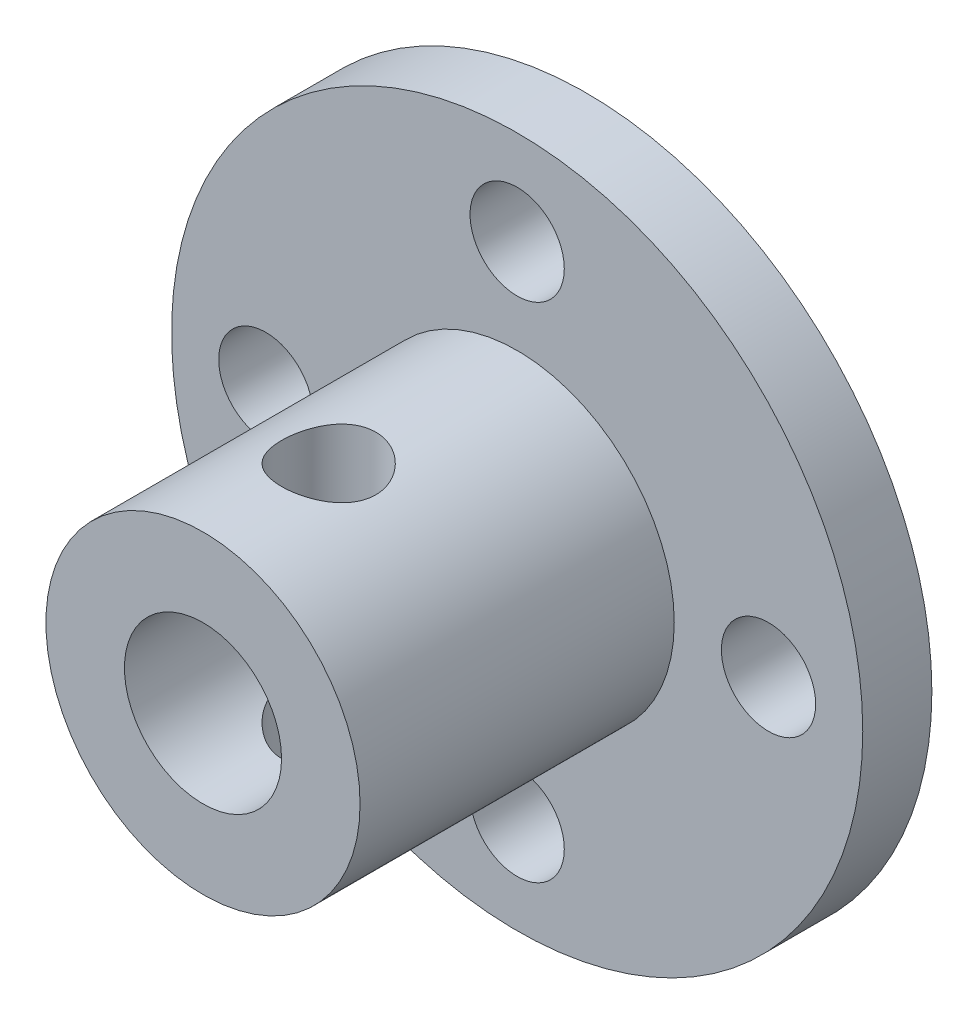
ISO-10303-21;
HEADER;
FILE_DESCRIPTION(('STEP AP214'),'2;1');
FILE_NAME('part.step','',(''),(''),'','','');
FILE_SCHEMA(('AUTOMOTIVE_DESIGN { 1 0 10303 214 1 1 1 1 }'));
ENDSEC;
DATA;
#1=APPLICATION_CONTEXT('core data for automotive mechanical design processes');
#2=APPLICATION_PROTOCOL_DEFINITION('international standard','automotive_design',2000,#1);
#3=PRODUCT_CONTEXT('',#1,'mechanical');
#4=PRODUCT('Part','Part','',(#3));
#5=PRODUCT_RELATED_PRODUCT_CATEGORY('part','',(#4));
#6=PRODUCT_DEFINITION_FORMATION('','',#4);
#7=PRODUCT_DEFINITION_CONTEXT('part definition',#1,'design');
#8=PRODUCT_DEFINITION('design','',#6,#7);
#9=PRODUCT_DEFINITION_SHAPE('','',#8);
#10=(LENGTH_UNIT() NAMED_UNIT(*) SI_UNIT(.MILLI.,.METRE.));
#11=(NAMED_UNIT(*) PLANE_ANGLE_UNIT() SI_UNIT($,.RADIAN.));
#12=(NAMED_UNIT(*) SI_UNIT($,.STERADIAN.) SOLID_ANGLE_UNIT());
#13=UNCERTAINTY_MEASURE_WITH_UNIT(LENGTH_MEASURE(1.E-05),#10,'distance_accuracy_value','');
#14=(GEOMETRIC_REPRESENTATION_CONTEXT(3) GLOBAL_UNCERTAINTY_ASSIGNED_CONTEXT((#13)) GLOBAL_UNIT_ASSIGNED_CONTEXT((#10,
#11,#12)) REPRESENTATION_CONTEXT('',''));
#15=CARTESIAN_POINT('',(0.,0.,0.));
#16=DIRECTION('',(0.,0.,1.));
#17=DIRECTION('',(1.,0.,0.));
#18=AXIS2_PLACEMENT_3D('',#15,#16,#17);
#19=CARTESIAN_POINT('',(0.,0.,2.2));
#20=DIRECTION('',(0.,0.,1.));
#21=DIRECTION('',(1.,0.,0.));
#22=AXIS2_PLACEMENT_3D('',#19,#20,#21);
#23=PLANE('',#22);
#24=CARTESIAN_POINT('',(0.,0.,2.2));
#25=DIRECTION('',(0.,0.,1.));
#26=DIRECTION('',(1.,0.,0.));
#27=AXIS2_PLACEMENT_3D('',#24,#25,#26);
#28=CIRCLE('',#27,5.);
#29=CARTESIAN_POINT('',(5.,0.,2.2));
#30=VERTEX_POINT('',#29);
#31=EDGE_CURVE('E142',#30,#30,#28,.T.);
#32=ORIENTED_EDGE('',*,*,#31,.F.);
#33=EDGE_LOOP('',(#32));
#34=FACE_BOUND('',#33,.T.);
#35=CARTESIAN_POINT('',(4.51808198568511E-13,-8.,2.2));
#36=DIRECTION('',(0.,0.,1.));
#37=DIRECTION('',(1.,0.,0.));
#38=AXIS2_PLACEMENT_3D('',#35,#36,#37);
#39=CIRCLE('',#38,1.50000000000049);
#40=CARTESIAN_POINT('',(1.50000000000094,-8.,2.2));
#41=VERTEX_POINT('',#40);
#42=EDGE_CURVE('E146',#41,#41,#39,.T.);
#43=ORIENTED_EDGE('',*,*,#42,.F.);
#44=EDGE_LOOP('',(#43));
#45=FACE_BOUND('',#44,.T.);
#46=CARTESIAN_POINT('',(0.,8.,2.2));
#47=DIRECTION('',(0.,0.,1.));
#48=DIRECTION('',(1.,0.,0.));
#49=AXIS2_PLACEMENT_3D('',#46,#47,#48);
#50=CIRCLE('',#49,1.5);
#51=CARTESIAN_POINT('',(1.5,8.,2.2));
#52=VERTEX_POINT('',#51);
#53=EDGE_CURVE('E49',#52,#52,#50,.T.);
#54=ORIENTED_EDGE('',*,*,#53,.F.);
#55=EDGE_LOOP('',(#54));
#56=FACE_BOUND('',#55,.T.);
#57=CARTESIAN_POINT('',(0.,0.,2.2));
#58=DIRECTION('',(0.,0.,1.));
#59=DIRECTION('',(1.,0.,0.));
#60=AXIS2_PLACEMENT_3D('',#57,#58,#59);
#61=CIRCLE('',#60,11.);
#62=CARTESIAN_POINT('',(11.,0.,2.2));
#63=VERTEX_POINT('',#62);
#64=EDGE_CURVE('E10',#63,#63,#61,.T.);
#65=ORIENTED_EDGE('',*,*,#64,.T.);
#66=EDGE_LOOP('',(#65));
#67=FACE_BOUND('',#66,.T.);
#68=CARTESIAN_POINT('',(8.00000000000023,2.25904099284255E-13,2.2));
#69=DIRECTION('',(0.,0.,1.));
#70=DIRECTION('',(1.,0.,0.));
#71=AXIS2_PLACEMENT_3D('',#68,#69,#70);
#72=CIRCLE('',#71,1.50000000000018);
#73=CARTESIAN_POINT('',(9.5000000000004,2.25904099284255E-13,2.2));
#74=VERTEX_POINT('',#73);
#75=EDGE_CURVE('E150',#74,#74,#72,.T.);
#76=ORIENTED_EDGE('',*,*,#75,.F.);
#77=EDGE_LOOP('',(#76));
#78=FACE_BOUND('',#77,.T.);
#79=CARTESIAN_POINT('',(-7.99999999999977,-2.26883816723573E-13,2.2));
#80=DIRECTION('',(0.,0.,1.));
#81=DIRECTION('',(1.,0.,0.));
#82=AXIS2_PLACEMENT_3D('',#79,#80,#81);
#83=CIRCLE('',#82,1.50000000000036);
#84=CARTESIAN_POINT('',(-6.49999999999941,-2.26883816723573E-13,2.2));
#85=VERTEX_POINT('',#84);
#86=EDGE_CURVE('E136',#85,#85,#83,.T.);
#87=ORIENTED_EDGE('',*,*,#86,.F.);
#88=EDGE_LOOP('',(#87));
#89=FACE_BOUND('',#88,.T.);
#90=ADVANCED_FACE('F31',(#34,#45,#56,#67,#78,#89),#23,.T.);
#91=CARTESIAN_POINT('',(0.,0.,0.));
#92=DIRECTION('',(0.,0.,1.));
#93=DIRECTION('',(1.,0.,0.));
#94=AXIS2_PLACEMENT_3D('',#91,#92,#93);
#95=PLANE('',#94);
#96=CARTESIAN_POINT('',(0.,0.,0.));
#97=DIRECTION('',(0.,0.,1.));
#98=DIRECTION('',(1.,0.,0.));
#99=AXIS2_PLACEMENT_3D('',#96,#97,#98);
#100=CIRCLE('',#99,2.5);
#101=CARTESIAN_POINT('',(2.5,0.,0.));
#102=VERTEX_POINT('',#101);
#103=EDGE_CURVE('E118',#102,#102,#100,.T.);
#104=ORIENTED_EDGE('',*,*,#103,.T.);
#105=EDGE_LOOP('',(#104));
#106=FACE_BOUND('',#105,.T.);
#107=CARTESIAN_POINT('',(0.,0.,0.));
#108=DIRECTION('',(0.,0.,1.));
#109=DIRECTION('',(1.,0.,0.));
#110=AXIS2_PLACEMENT_3D('',#107,#108,#109);
#111=CIRCLE('',#110,11.);
#112=CARTESIAN_POINT('',(11.,0.,0.));
#113=VERTEX_POINT('',#112);
#114=EDGE_CURVE('E44',#113,#113,#111,.T.);
#115=ORIENTED_EDGE('',*,*,#114,.F.);
#116=EDGE_LOOP('',(#115));
#117=FACE_BOUND('',#116,.T.);
#118=CARTESIAN_POINT('',(0.,8.,0.));
#119=DIRECTION('',(0.,0.,1.));
#120=DIRECTION('',(1.,0.,0.));
#121=AXIS2_PLACEMENT_3D('',#118,#119,#120);
#122=CIRCLE('',#121,1.5);
#123=CARTESIAN_POINT('',(1.5,8.,0.));
#124=VERTEX_POINT('',#123);
#125=EDGE_CURVE('E52',#124,#124,#122,.T.);
#126=ORIENTED_EDGE('',*,*,#125,.T.);
#127=EDGE_LOOP('',(#126));
#128=FACE_BOUND('',#127,.T.);
#129=CARTESIAN_POINT('',(8.00000000000023,2.25904099284255E-13,0.));
#130=DIRECTION('',(0.,0.,1.));
#131=DIRECTION('',(1.,0.,0.));
#132=AXIS2_PLACEMENT_3D('',#129,#130,#131);
#133=CIRCLE('',#132,1.50000000000018);
#134=CARTESIAN_POINT('',(9.5000000000004,2.25904099284255E-13,0.));
#135=VERTEX_POINT('',#134);
#136=EDGE_CURVE('E127',#135,#135,#133,.T.);
#137=ORIENTED_EDGE('',*,*,#136,.T.);
#138=EDGE_LOOP('',(#137));
#139=FACE_BOUND('',#138,.T.);
#140=CARTESIAN_POINT('',(4.51808198568511E-13,-8.,0.));
#141=DIRECTION('',(0.,0.,1.));
#142=DIRECTION('',(1.,0.,0.));
#143=AXIS2_PLACEMENT_3D('',#140,#141,#142);
#144=CIRCLE('',#143,1.50000000000049);
#145=CARTESIAN_POINT('',(1.50000000000094,-8.,0.));
#146=VERTEX_POINT('',#145);
#147=EDGE_CURVE('E131',#146,#146,#144,.T.);
#148=ORIENTED_EDGE('',*,*,#147,.T.);
#149=EDGE_LOOP('',(#148));
#150=FACE_BOUND('',#149,.T.);
#151=CARTESIAN_POINT('',(-7.99999999999977,-2.26883816723573E-13,0.));
#152=DIRECTION('',(0.,0.,1.));
#153=DIRECTION('',(1.,0.,0.));
#154=AXIS2_PLACEMENT_3D('',#151,#152,#153);
#155=CIRCLE('',#154,1.50000000000036);
#156=CARTESIAN_POINT('',(-6.49999999999941,-2.26883816723573E-13,0.));
#157=VERTEX_POINT('',#156);
#158=EDGE_CURVE('E134',#157,#157,#155,.T.);
#159=ORIENTED_EDGE('',*,*,#158,.T.);
#160=EDGE_LOOP('',(#159));
#161=FACE_BOUND('',#160,.T.);
#162=ADVANCED_FACE('F107',(#106,#117,#128,#139,#150,#161),#95,.F.);
#163=CARTESIAN_POINT('',(0.,0.,2.2));
#164=DIRECTION('',(0.,0.,-1.));
#165=DIRECTION('',(-1.,0.,0.));
#166=AXIS2_PLACEMENT_3D('',#163,#164,#165);
#167=CYLINDRICAL_SURFACE('',#166,11.);
#168=ORIENTED_EDGE('',*,*,#64,.F.);
#169=EDGE_LOOP('',(#168));
#170=FACE_BOUND('',#169,.T.);
#171=ORIENTED_EDGE('',*,*,#114,.T.);
#172=EDGE_LOOP('',(#171));
#173=FACE_BOUND('',#172,.T.);
#174=ADVANCED_FACE('F33',(#170,#173),#167,.T.);
#175=CARTESIAN_POINT('',(0.,8.,2.2));
#176=DIRECTION('',(0.,0.,-1.));
#177=DIRECTION('',(-1.,0.,0.));
#178=AXIS2_PLACEMENT_3D('',#175,#176,#177);
#179=CYLINDRICAL_SURFACE('',#178,1.5);
#180=ORIENTED_EDGE('',*,*,#53,.T.);
#181=EDGE_LOOP('',(#180));
#182=FACE_BOUND('',#181,.T.);
#183=ORIENTED_EDGE('',*,*,#125,.F.);
#184=EDGE_LOOP('',(#183));
#185=FACE_BOUND('',#184,.T.);
#186=ADVANCED_FACE('F101',(#182,#185),#179,.F.);
#187=CARTESIAN_POINT('',(8.00000000000023,2.25904099284255E-13,2.2));
#188=DIRECTION('',(0.,0.,-1.));
#189=DIRECTION('',(-1.,0.,0.));
#190=AXIS2_PLACEMENT_3D('',#187,#188,#189);
#191=CYLINDRICAL_SURFACE('',#190,1.50000000000018);
#192=ORIENTED_EDGE('',*,*,#75,.T.);
#193=EDGE_LOOP('',(#192));
#194=FACE_BOUND('',#193,.T.);
#195=ORIENTED_EDGE('',*,*,#136,.F.);
#196=EDGE_LOOP('',(#195));
#197=FACE_BOUND('',#196,.T.);
#198=ADVANCED_FACE('F97',(#194,#197),#191,.F.);
#199=CARTESIAN_POINT('',(4.51808198568511E-13,-8.,2.2));
#200=DIRECTION('',(0.,0.,-1.));
#201=DIRECTION('',(-1.,0.,0.));
#202=AXIS2_PLACEMENT_3D('',#199,#200,#201);
#203=CYLINDRICAL_SURFACE('',#202,1.50000000000049);
#204=ORIENTED_EDGE('',*,*,#42,.T.);
#205=EDGE_LOOP('',(#204));
#206=FACE_BOUND('',#205,.T.);
#207=ORIENTED_EDGE('',*,*,#147,.F.);
#208=EDGE_LOOP('',(#207));
#209=FACE_BOUND('',#208,.T.);
#210=ADVANCED_FACE('F93',(#206,#209),#203,.F.);
#211=CARTESIAN_POINT('',(-7.99999999999977,-2.26883816723573E-13,2.2));
#212=DIRECTION('',(0.,0.,-1.));
#213=DIRECTION('',(-1.,0.,0.));
#214=AXIS2_PLACEMENT_3D('',#211,#212,#213);
#215=CYLINDRICAL_SURFACE('',#214,1.50000000000036);
#216=ORIENTED_EDGE('',*,*,#86,.T.);
#217=EDGE_LOOP('',(#216));
#218=FACE_BOUND('',#217,.T.);
#219=ORIENTED_EDGE('',*,*,#158,.F.);
#220=EDGE_LOOP('',(#219));
#221=FACE_BOUND('',#220,.T.);
#222=ADVANCED_FACE('F88',(#218,#221),#215,.F.);
#223=CARTESIAN_POINT('',(0.,0.,12.2));
#224=DIRECTION('',(0.,0.,-1.));
#225=DIRECTION('',(-1.,0.,0.));
#226=AXIS2_PLACEMENT_3D('',#223,#224,#225);
#227=CYLINDRICAL_SURFACE('',#226,5.);
#228=CARTESIAN_POINT('',(0.,-5.,9.7));
#229=CARTESIAN_POINT('',(0.0822886127533008,-4.9999992925055,9.69999900251511));
#230=CARTESIAN_POINT('',(0.16458731835153,-4.99794915693954,9.69320613637603));
#231=CARTESIAN_POINT('',(0.326788125304882,-4.98997105593691,9.6662786457779));
#232=CARTESIAN_POINT('',(0.406689504411421,-4.98404193389692,9.64614004197666));
#233=CARTESIAN_POINT('',(0.561732707754527,-4.96895552501836,9.59325398308974));
#234=CARTESIAN_POINT('',(0.636881364395373,-4.95980300250425,9.56052513038106));
#235=CARTESIAN_POINT('',(0.780624181053132,-4.93922109237645,9.48346390694416));
#236=CARTESIAN_POINT('',(0.84921746746967,-4.92779140192067,9.43912999260458));
#237=CARTESIAN_POINT('',(0.979871797183746,-4.90350737192774,9.33877599252733));
#238=CARTESIAN_POINT('',(1.04171807124434,-4.89062383657036,9.28248337411409));
#239=CARTESIAN_POINT('',(1.15524920923324,-4.86505834210442,9.16039077008982));
#240=CARTESIAN_POINT('',(1.20693236327441,-4.85237641724501,9.09458918787504));
#241=CARTESIAN_POINT('',(1.29980037723708,-4.82834113993772,8.95352924696239));
#242=CARTESIAN_POINT('',(1.34072309022213,-4.81702406663875,8.87809153900926));
#243=CARTESIAN_POINT('',(1.4092139477476,-4.79743620394031,8.72101074576971));
#244=CARTESIAN_POINT('',(1.43678529919973,-4.78916468313311,8.63936915607203));
#245=CARTESIAN_POINT('',(1.47701633682652,-4.77690870838434,8.47460973386954));
#246=CARTESIAN_POINT('',(1.49007196234678,-4.77281069324533,8.39159725613606));
#247=CARTESIAN_POINT('',(1.50213730614672,-4.76902789749767,8.22446684378323));
#248=CARTESIAN_POINT('',(1.50115042761078,-4.76934204760571,8.14034918194091));
#249=CARTESIAN_POINT('',(1.48546977199812,-4.77424744067778,7.97661609139152));
#250=CARTESIAN_POINT('',(1.47127205262685,-4.77868388599141,7.89694774963776));
#251=CARTESIAN_POINT('',(1.43037420427056,-4.79108356228624,7.74118021372654));
#252=CARTESIAN_POINT('',(1.40367284141641,-4.79904714132351,7.66508137262567));
#253=CARTESIAN_POINT('',(1.33816026653682,-4.81772733074973,7.51739965033926));
#254=CARTESIAN_POINT('',(1.29918816934643,-4.82848016115952,7.44589291604474));
#255=CARTESIAN_POINT('',(1.21035222588683,-4.85150987000064,7.31026797798981));
#256=CARTESIAN_POINT('',(1.16048574002589,-4.86378711746991,7.24615157058622));
#257=CARTESIAN_POINT('',(1.04881290765546,-4.88911011297937,7.12431380923798));
#258=CARTESIAN_POINT('',(0.986594907466974,-4.90216654310498,7.06697133597033));
#259=CARTESIAN_POINT('',(0.853263259313969,-4.92712244063258,6.96344601593575));
#260=CARTESIAN_POINT('',(0.78214905186089,-4.9390218351841,6.91726387158557));
#261=CARTESIAN_POINT('',(0.632355038342805,-4.9604316006947,6.83714007753527));
#262=CARTESIAN_POINT('',(0.553627749747952,-4.96992543668314,6.80328248375014));
#263=CARTESIAN_POINT('',(0.391245415603521,-4.98533521832222,6.74940040990037));
#264=CARTESIAN_POINT('',(0.307591751589583,-4.99125216186999,6.72937207146751));
#265=CARTESIAN_POINT('',(0.140952242668334,-4.99868364643538,6.70434782210061));
#266=CARTESIAN_POINT('',(0.0580500976011888,-5.0003485041779,6.69883841419839));
#267=CARTESIAN_POINT('',(-0.107499605823381,-4.9995292324176,6.70156915571208));
#268=CARTESIAN_POINT('',(-0.190147196690779,-4.99704565677756,6.70980746965144));
#269=CARTESIAN_POINT('',(-0.350903605309695,-4.98830696987163,6.7393846111115));
#270=CARTESIAN_POINT('',(-0.429072772614168,-4.98213829799417,6.76042338758087));
#271=CARTESIAN_POINT('',(-0.58075463895452,-4.96674347841533,6.8146432327782));
#272=CARTESIAN_POINT('',(-0.654266777025582,-4.95751696321085,6.84782576103786));
#273=CARTESIAN_POINT('',(-0.796437189461051,-4.93669654351325,6.92625316548113));
#274=CARTESIAN_POINT('',(-0.864943826199668,-4.92505280829675,6.97175934094797));
#275=CARTESIAN_POINT('',(-0.993523307980146,-4.90073468764318,7.07322475405281));
#276=CARTESIAN_POINT('',(-1.05359403235593,-4.8880600443108,7.12918661188767));
#277=CARTESIAN_POINT('',(-1.16585744551027,-4.86253171869138,7.25238730836935));
#278=CARTESIAN_POINT('',(-1.21768481231503,-4.84968825033268,7.31996187577174));
#279=CARTESIAN_POINT('',(-1.30928995072153,-4.82576515238463,7.46312793901353));
#280=CARTESIAN_POINT('',(-1.34906803829472,-4.81468547654651,7.53871922455821));
#281=CARTESIAN_POINT('',(-1.41517347127168,-4.79567189615055,7.69553249125469));
#282=CARTESIAN_POINT('',(-1.4415634693705,-4.78772337843827,7.77672618653659));
#283=CARTESIAN_POINT('',(-1.48021730815114,-4.77591594362794,7.94268796893148));
#284=CARTESIAN_POINT('',(-1.49248598978779,-4.772055625083,8.02745482078767));
#285=CARTESIAN_POINT('',(-1.50221984485059,-4.76899972496087,8.19436151837623));
#286=CARTESIAN_POINT('',(-1.5002805530849,-4.76961647442754,8.27646365101759));
#287=CARTESIAN_POINT('',(-1.48307505444813,-4.77499401288294,8.4391141033728));
#288=CARTESIAN_POINT('',(-1.46780938124716,-4.77975463592551,8.51966248517635));
#289=CARTESIAN_POINT('',(-1.42476888804136,-4.79275763670386,8.67594539914285));
#290=CARTESIAN_POINT('',(-1.39715175507068,-4.80095604545965,8.75172728736169));
#291=CARTESIAN_POINT('',(-1.33031507121129,-4.81990278909136,8.89764243881772));
#292=CARTESIAN_POINT('',(-1.29109329962876,-4.83065161194312,8.96777461764076));
#293=CARTESIAN_POINT('',(-1.20048763805072,-4.85397676425833,9.10316311652711));
#294=CARTESIAN_POINT('',(-1.14871276092994,-4.86660540163798,9.16814876126041));
#295=CARTESIAN_POINT('',(-1.03517434629782,-4.89201320450026,9.28870249830786));
#296=CARTESIAN_POINT('',(-0.973408217134501,-4.90479240823905,9.34426813946776));
#297=CARTESIAN_POINT('',(-0.839465762183248,-4.92950936570649,9.44602341229503));
#298=CARTESIAN_POINT('',(-0.767037885790606,-4.94141159765674,9.49189144685549));
#299=CARTESIAN_POINT('',(-0.615141373983528,-4.96260680455813,9.57073516990403));
#300=CARTESIAN_POINT('',(-0.535676052998954,-4.97190099931067,9.60371688827451));
#301=CARTESIAN_POINT('',(-0.380757712655281,-4.98602174969301,9.65289527565275));
#302=CARTESIAN_POINT('',(-0.305786961954233,-4.99122027381068,9.67051167288325));
#303=CARTESIAN_POINT('',(-0.153880195230779,-4.99820944494492,9.69406352524158));
#304=CARTESIAN_POINT('',(-0.0769445098581386,-5.0000006615474,9.70000093270482));
#305=CARTESIAN_POINT('',(0.,-5.,9.7));
#306=B_SPLINE_CURVE_WITH_KNOTS('',3,(#228,#229,#230,#231,#232,#233,#234,#235,#236,#237,#238,
#239,#240,#241,#242,#243,#244,#245,#246,#247,#248,#249,#250,#251,#252,#253,#254,#255,#256,#257,
#258,#259,#260,#261,#262,#263,#264,#265,#266,#267,#268,#269,#270,#271,#272,#273,#274,#275,#276,
#277,#278,#279,#280,#281,#282,#283,#284,#285,#286,#287,#288,#289,#290,#291,#292,#293,#294,#295,
#296,#297,#298,#299,#300,#301,#302,#303,#304,#305),.UNSPECIFIED.,.T.,.F.,(4,2,2,2,2,2,2,2,2,2,2,
2,2,2,2,2,2,2,2,2,2,2,2,2,2,2,2,2,2,2,2,2,2,2,2,2,2,2,4),(0.,0.24658320361261,0.493239964845999,
0.739533676300874,0.985860164412701,1.23855602948191,1.49129437288633,1.74971481004109,
2.00807314543223,2.25919689356599,2.51025978319089,2.75226016697676,2.99428443658001,
3.23962426447119,3.48502360158555,3.74067104048166,3.99633456531071,4.25371046881688,
4.51101453528808,4.75908809438545,5.00712853550327,5.24956746682327,5.49203554593728,
5.74011305702908,5.98825282000191,6.24540400322818,6.5025484425268,6.75847814951252,
7.01432009460283,7.25950155466943,7.504673196616,7.74680040402721,7.98897397553107,
8.23996925679931,8.49102974897502,8.74942996156671,9.00770911595235,9.23831691930459,
9.46888616948874),.UNSPECIFIED.);
#307=CARTESIAN_POINT('',(0.,-5.,9.7));
#308=VERTEX_POINT('',#307);
#309=EDGE_CURVE('E78',#308,#308,#306,.T.);
#310=ORIENTED_EDGE('',*,*,#309,.T.);
#311=EDGE_LOOP('',(#310));
#312=FACE_BOUND('',#311,.T.);
#313=CARTESIAN_POINT('',(0.,5.,9.7));
#314=CARTESIAN_POINT('',(-0.0822886127532989,4.9999992925055,9.69999900251511));
#315=CARTESIAN_POINT('',(-0.164587318351528,4.99794915693954,9.69320613637603));
#316=CARTESIAN_POINT('',(-0.32678812530488,4.98997105593691,9.6662786457779));
#317=CARTESIAN_POINT('',(-0.406689504411419,4.98404193389692,9.64614004197666));
#318=CARTESIAN_POINT('',(-0.561732707754525,4.96895552501836,9.59325398308974));
#319=CARTESIAN_POINT('',(-0.636881364395371,4.95980300250425,9.56052513038106));
#320=CARTESIAN_POINT('',(-0.78062418105313,4.93922109237645,9.48346390694416));
#321=CARTESIAN_POINT('',(-0.849217467469668,4.92779140192067,9.43912999260458));
#322=CARTESIAN_POINT('',(-0.979871797183745,4.90350737192774,9.33877599252733));
#323=CARTESIAN_POINT('',(-1.04171807124434,4.89062383657036,9.28248337411409));
#324=CARTESIAN_POINT('',(-1.15524920923324,4.86505834210442,9.16039077008982));
#325=CARTESIAN_POINT('',(-1.20693236327441,4.85237641724501,9.09458918787504));
#326=CARTESIAN_POINT('',(-1.29980037723708,4.82834113993772,8.95352924696239));
#327=CARTESIAN_POINT('',(-1.34072309022213,4.81702406663875,8.87809153900926));
#328=CARTESIAN_POINT('',(-1.4092139477476,4.79743620394031,8.72101074576971));
#329=CARTESIAN_POINT('',(-1.43678529919973,4.78916468313311,8.63936915607203));
#330=CARTESIAN_POINT('',(-1.47701633682652,4.77690870838434,8.47460973386954));
#331=CARTESIAN_POINT('',(-1.49007196234677,4.77281069324533,8.39159725613606));
#332=CARTESIAN_POINT('',(-1.50213730614672,4.76902789749767,8.22446684378323));
#333=CARTESIAN_POINT('',(-1.50115042761078,4.76934204760571,8.14034918194091));
#334=CARTESIAN_POINT('',(-1.48546977199812,4.77424744067778,7.97661609139152));
#335=CARTESIAN_POINT('',(-1.47127205262685,4.77868388599141,7.89694774963776));
#336=CARTESIAN_POINT('',(-1.43037420427056,4.79108356228624,7.74118021372654));
#337=CARTESIAN_POINT('',(-1.40367284141641,4.79904714132351,7.66508137262567));
#338=CARTESIAN_POINT('',(-1.33816026653682,4.81772733074973,7.51739965033926));
#339=CARTESIAN_POINT('',(-1.29918816934642,4.82848016115952,7.44589291604474));
#340=CARTESIAN_POINT('',(-1.21035222588683,4.85150987000065,7.31026797798981));
#341=CARTESIAN_POINT('',(-1.16048574002588,4.86378711746991,7.24615157058622));
#342=CARTESIAN_POINT('',(-1.04881290765546,4.88911011297937,7.12431380923798));
#343=CARTESIAN_POINT('',(-0.986594907466971,4.90216654310498,7.06697133597033));
#344=CARTESIAN_POINT('',(-0.853263259313966,4.92712244063259,6.96344601593575));
#345=CARTESIAN_POINT('',(-0.782149051860887,4.9390218351841,6.91726387158557));
#346=CARTESIAN_POINT('',(-0.632355038342802,4.9604316006947,6.83714007753527));
#347=CARTESIAN_POINT('',(-0.553627749747949,4.96992543668314,6.80328248375014));
#348=CARTESIAN_POINT('',(-0.391245415603518,4.98533521832222,6.74940040990037));
#349=CARTESIAN_POINT('',(-0.30759175158958,4.99125216186999,6.72937207146751));
#350=CARTESIAN_POINT('',(-0.14095224266833,4.99868364643538,6.70434782210061));
#351=CARTESIAN_POINT('',(-0.0580500976011858,5.0003485041779,6.69883841419839));
#352=CARTESIAN_POINT('',(0.107499605823384,4.9995292324176,6.70156915571208));
#353=CARTESIAN_POINT('',(0.190147196690782,4.99704565677756,6.70980746965144));
#354=CARTESIAN_POINT('',(0.350903605309698,4.98830696987163,6.7393846111115));
#355=CARTESIAN_POINT('',(0.429072772614171,4.98213829799417,6.76042338758087));
#356=CARTESIAN_POINT('',(0.580754638954523,4.96674347841533,6.8146432327782));
#357=CARTESIAN_POINT('',(0.654266777025585,4.95751696321085,6.84782576103786));
#358=CARTESIAN_POINT('',(0.796437189461054,4.93669654351325,6.92625316548113));
#359=CARTESIAN_POINT('',(0.864943826199671,4.92505280829675,6.97175934094797));
#360=CARTESIAN_POINT('',(0.993523307980148,4.90073468764317,7.07322475405281));
#361=CARTESIAN_POINT('',(1.05359403235594,4.8880600443108,7.12918661188767));
#362=CARTESIAN_POINT('',(1.16585744551027,4.86253171869138,7.25238730836935));
#363=CARTESIAN_POINT('',(1.21768481231504,4.84968825033268,7.31996187577174));
#364=CARTESIAN_POINT('',(1.30928995072154,4.82576515238463,7.46312793901353));
#365=CARTESIAN_POINT('',(1.34906803829472,4.81468547654651,7.53871922455822));
#366=CARTESIAN_POINT('',(1.41517347127168,4.79567189615055,7.69553249125469));
#367=CARTESIAN_POINT('',(1.4415634693705,4.78772337843827,7.77672618653659));
#368=CARTESIAN_POINT('',(1.48021730815114,4.77591594362794,7.94268796893148));
#369=CARTESIAN_POINT('',(1.49248598978779,4.772055625083,8.02745482078767));
#370=CARTESIAN_POINT('',(1.50221984485059,4.76899972496087,8.19436151837623));
#371=CARTESIAN_POINT('',(1.5002805530849,4.76961647442754,8.27646365101759));
#372=CARTESIAN_POINT('',(1.48307505444813,4.77499401288294,8.4391141033728));
#373=CARTESIAN_POINT('',(1.46780938124716,4.77975463592551,8.51966248517635));
#374=CARTESIAN_POINT('',(1.42476888804136,4.79275763670386,8.67594539914285));
#375=CARTESIAN_POINT('',(1.39715175507069,4.80095604545965,8.75172728736169));
#376=CARTESIAN_POINT('',(1.33031507121129,4.81990278909136,8.89764243881772));
#377=CARTESIAN_POINT('',(1.29109329962876,4.83065161194312,8.96777461764076));
#378=CARTESIAN_POINT('',(1.20048763805072,4.85397676425833,9.10316311652711));
#379=CARTESIAN_POINT('',(1.14871276092994,4.86660540163797,9.16814876126041));
#380=CARTESIAN_POINT('',(1.03517434629782,4.89201320450026,9.28870249830786));
#381=CARTESIAN_POINT('',(0.973408217134501,4.90479240823905,9.34426813946776));
#382=CARTESIAN_POINT('',(0.839465762183248,4.92950936570649,9.44602341229503));
#383=CARTESIAN_POINT('',(0.767037885790608,4.94141159765674,9.49189144685549));
#384=CARTESIAN_POINT('',(0.61514137398353,4.96260680455813,9.57073516990403));
#385=CARTESIAN_POINT('',(0.535676052998956,4.97190099931067,9.60371688827451));
#386=CARTESIAN_POINT('',(0.380757712655283,4.98602174969301,9.65289527565275));
#387=CARTESIAN_POINT('',(0.305786961954235,4.99122027381068,9.67051167288325));
#388=CARTESIAN_POINT('',(0.153880195230781,4.99820944494492,9.69406352524158));
#389=CARTESIAN_POINT('',(0.0769445098581406,5.0000006615474,9.70000093270482));
#390=CARTESIAN_POINT('',(0.,5.,9.7));
#391=B_SPLINE_CURVE_WITH_KNOTS('',3,(#313,#314,#315,#316,#317,#318,#319,#320,#321,#322,#323,
#324,#325,#326,#327,#328,#329,#330,#331,#332,#333,#334,#335,#336,#337,#338,#339,#340,#341,#342,
#343,#344,#345,#346,#347,#348,#349,#350,#351,#352,#353,#354,#355,#356,#357,#358,#359,#360,#361,
#362,#363,#364,#365,#366,#367,#368,#369,#370,#371,#372,#373,#374,#375,#376,#377,#378,#379,#380,
#381,#382,#383,#384,#385,#386,#387,#388,#389,#390),.UNSPECIFIED.,.T.,.F.,(4,2,2,2,2,2,2,2,2,2,2,
2,2,2,2,2,2,2,2,2,2,2,2,2,2,2,2,2,2,2,2,2,2,2,2,2,2,2,4),(0.,0.24658320361261,0.493239964845999,
0.739533676300874,0.985860164412701,1.23855602948192,1.49129437288633,1.74971481004109,
2.00807314543224,2.25919689356599,2.51025978319089,2.75226016697676,2.99428443658001,
3.2396242644712,3.48502360158555,3.74067104048167,3.99633456531072,4.25371046881689,
4.51101453528808,4.75908809438545,5.00712853550327,5.24956746682327,5.49203554593729,
5.74011305702908,5.98825282000191,6.24540400322819,6.50254844252681,6.75847814951252,
7.01432009460283,7.25950155466943,7.504673196616,7.74680040402721,7.98897397553107,
8.23996925679931,8.49102974897503,8.74942996156671,9.00770911595235,9.2383169193046,
9.46888616948875),.UNSPECIFIED.);
#392=CARTESIAN_POINT('',(0.,5.,9.7));
#393=VERTEX_POINT('',#392);
#394=EDGE_CURVE('E72',#393,#393,#391,.T.);
#395=ORIENTED_EDGE('',*,*,#394,.T.);
#396=EDGE_LOOP('',(#395));
#397=FACE_BOUND('',#396,.T.);
#398=CARTESIAN_POINT('',(0.,0.,12.2));
#399=DIRECTION('',(0.,0.,1.));
#400=DIRECTION('',(1.,0.,0.));
#401=AXIS2_PLACEMENT_3D('',#398,#399,#400);
#402=CIRCLE('',#401,5.);
#403=CARTESIAN_POINT('',(5.,0.,12.2));
#404=VERTEX_POINT('',#403);
#405=EDGE_CURVE('E137',#404,#404,#402,.T.);
#406=ORIENTED_EDGE('',*,*,#405,.F.);
#407=EDGE_LOOP('',(#406));
#408=FACE_BOUND('',#407,.T.);
#409=ORIENTED_EDGE('',*,*,#31,.T.);
#410=EDGE_LOOP('',(#409));
#411=FACE_BOUND('',#410,.T.);
#412=ADVANCED_FACE('F83',(#312,#397,#408,#411),#227,.T.);
#413=CARTESIAN_POINT('',(0.,0.,12.2));
#414=DIRECTION('',(0.,0.,1.));
#415=DIRECTION('',(1.,0.,0.));
#416=AXIS2_PLACEMENT_3D('',#413,#414,#415);
#417=PLANE('',#416);
#418=CARTESIAN_POINT('',(0.,0.,12.2));
#419=DIRECTION('',(0.,0.,1.));
#420=DIRECTION('',(1.,0.,0.));
#421=AXIS2_PLACEMENT_3D('',#418,#419,#420);
#422=CIRCLE('',#421,2.5);
#423=CARTESIAN_POINT('',(2.5,0.,12.2));
#424=VERTEX_POINT('',#423);
#425=EDGE_CURVE('E167',#424,#424,#422,.T.);
#426=ORIENTED_EDGE('',*,*,#425,.F.);
#427=EDGE_LOOP('',(#426));
#428=FACE_BOUND('',#427,.T.);
#429=ORIENTED_EDGE('',*,*,#405,.T.);
#430=EDGE_LOOP('',(#429));
#431=FACE_BOUND('',#430,.T.);
#432=ADVANCED_FACE('F87',(#428,#431),#417,.T.);
#433=CARTESIAN_POINT('',(0.,0.,0.));
#434=DIRECTION('',(0.,0.,1.));
#435=DIRECTION('',(1.,0.,0.));
#436=AXIS2_PLACEMENT_3D('',#433,#434,#435);
#437=CYLINDRICAL_SURFACE('',#436,2.5);
#438=CARTESIAN_POINT('',(0.,-2.5,9.7));
#439=CARTESIAN_POINT('',(-0.0767298334620149,-2.49999625789732,9.69999590899012));
#440=CARTESIAN_POINT('',(-0.153582320644177,-2.4964290461501,9.69407132907374));
#441=CARTESIAN_POINT('',(-0.304975509530678,-2.48249903608568,9.67067568048468));
#442=CARTESIAN_POINT('',(-0.379510034596046,-2.47211948032719,9.65317613814578));
#443=CARTESIAN_POINT('',(-0.523751827790836,-2.44561558054488,9.60761363883314));
#444=CARTESIAN_POINT('',(-0.593481028226565,-2.42951973272944,9.57960304183684));
#445=CARTESIAN_POINT('',(-0.727030318214658,-2.39295367626407,9.51413966685897));
#446=CARTESIAN_POINT('',(-0.790851869416382,-2.37248455380255,9.47668923303126));
#447=CARTESIAN_POINT('',(-0.916299278999314,-2.32705360719088,9.39022517329142));
#448=CARTESIAN_POINT('',(-0.977384020081414,-2.30186792195985,9.34054630464861));
#449=CARTESIAN_POINT('',(-1.09088270411891,-2.25030439279634,9.23253279617173));
#450=CARTESIAN_POINT('',(-1.14328534948112,-2.22392505153571,9.17418706281268));
#451=CARTESIAN_POINT('',(-1.24444996762974,-2.1691106699591,9.04207648950327));
#452=CARTESIAN_POINT('',(-1.29197766378809,-2.14082017703649,8.96729822901871));
#453=CARTESIAN_POINT('',(-1.37361437764896,-2.08938301412124,8.80915342675689));
#454=CARTESIAN_POINT('',(-1.40774517335159,-2.06622802273938,8.72580110375243));
#455=CARTESIAN_POINT('',(-1.45440601714221,-2.0335462966093,8.57340354934676));
#456=CARTESIAN_POINT('',(-1.47016197246826,-2.02207883137591,8.50576400138968));
#457=CARTESIAN_POINT('',(-1.49216172340475,-2.00590308295503,8.36819628416964));
#458=CARTESIAN_POINT('',(-1.49841734556836,-2.0011863964376,8.29827107124551));
#459=CARTESIAN_POINT('',(-1.50105508796009,-1.99920922463856,8.15798850578266));
#460=CARTESIAN_POINT('',(-1.49741783408418,-2.00196337012718,8.0876305749068));
#461=CARTESIAN_POINT('',(-1.48046060478828,-2.01453261443741,7.94872122457241));
#462=CARTESIAN_POINT('',(-1.46713334620103,-2.02435302432226,7.88017120415256));
#463=CARTESIAN_POINT('',(-1.43173921881792,-2.04953186944258,7.7474697578719));
#464=CARTESIAN_POINT('',(-1.40978748666087,-2.06481711652537,7.68327294607552));
#465=CARTESIAN_POINT('',(-1.35795061770837,-2.09927051350828,7.55930500907188));
#466=CARTESIAN_POINT('',(-1.32806257259705,-2.11844008623465,7.49953551657607));
#467=CARTESIAN_POINT('',(-1.25517983184583,-2.16255327268985,7.3750159028772));
#468=CARTESIAN_POINT('',(-1.21080724397723,-2.18792043372992,7.31122190704507));
#469=CARTESIAN_POINT('',(-1.11291092784003,-2.23930599764381,7.19132351633298));
#470=CARTESIAN_POINT('',(-1.05937845100578,-2.26532500262149,7.13522656602349));
#471=CARTESIAN_POINT('',(-0.935811834382963,-2.31935504958317,7.02438701817824));
#472=CARTESIAN_POINT('',(-0.864517682704954,-2.34713836268533,6.97092269398401));
#473=CARTESIAN_POINT('',(-0.712276050458997,-2.39772428433981,6.87687795280209));
#474=CARTESIAN_POINT('',(-0.631333763943561,-2.42052955425515,6.83629064621005));
#475=CARTESIAN_POINT('',(-0.467197585268203,-2.45730392066151,6.7720678172041));
#476=CARTESIAN_POINT('',(-0.384467624173577,-2.47173957439704,6.74752464428409));
#477=CARTESIAN_POINT('',(-0.215047895144637,-2.49218842813551,6.71298880259462));
#478=CARTESIAN_POINT('',(-0.128363005661316,-2.49821172952738,6.70297868224643));
#479=CARTESIAN_POINT('',(0.0337146143773995,-2.5009057037461,6.69849215232169));
#480=CARTESIAN_POINT('',(0.109042473418721,-2.49873521714286,6.70209114491483));
#481=CARTESIAN_POINT('',(0.257829401986063,-2.48778712087048,6.72042585307192));
#482=CARTESIAN_POINT('',(0.331288509376108,-2.47900964518037,6.73516134280581));
#483=CARTESIAN_POINT('',(0.472574932157615,-2.4559479244219,6.77454343281246));
#484=CARTESIAN_POINT('',(0.540495750928486,-2.44180275662555,6.79894034907347));
#485=CARTESIAN_POINT('',(0.671265749087265,-2.40913880862844,6.85667737636527));
#486=CARTESIAN_POINT('',(0.734113924963911,-2.39061916586511,6.89001925134667));
#487=CARTESIAN_POINT('',(0.860006262823866,-2.3484549623736,6.96855697920871));
#488=CARTESIAN_POINT('',(0.92239415045684,-2.3244780273988,7.0146238290784));
#489=CARTESIAN_POINT('',(1.03902603131014,-2.27474265574731,7.11539139348862));
#490=CARTESIAN_POINT('',(1.09326040273738,-2.2489821658636,7.17010215485254));
#491=CARTESIAN_POINT('',(1.19931996735579,-2.19445423909891,7.29491039003715));
#492=CARTESIAN_POINT('',(1.24991019630915,-2.16573241746291,7.36608388546551));
#493=CARTESIAN_POINT('',(1.33845238915668,-2.1121618206671,7.51721602456821));
#494=CARTESIAN_POINT('',(1.37641766769781,-2.0873089799769,7.59716529389279));
#495=CARTESIAN_POINT('',(1.43142578795777,-2.04984909240519,7.74624302230669));
#496=CARTESIAN_POINT('',(1.4512162533619,-2.03575659328728,7.81398031235859));
#497=CARTESIAN_POINT('',(1.48113663905972,-2.01409605743544,7.95253207808011));
#498=CARTESIAN_POINT('',(1.49127995297631,-2.0065189764272,8.02334214432783));
#499=CARTESIAN_POINT('',(1.50134130416631,-1.99900446616267,8.16637694759704));
#500=CARTESIAN_POINT('',(1.50122089107869,-1.99909576445937,8.23860599068705));
#501=CARTESIAN_POINT('',(1.49066472959328,-2.0069771789285,8.38189443560946));
#502=CARTESIAN_POINT('',(1.48022337215759,-2.0147714813882,8.4529531800806));
#503=CARTESIAN_POINT('',(1.45040174148913,-2.0363318524298,8.58848841757219));
#504=CARTESIAN_POINT('',(1.43147636845351,-2.0497921180558,8.65311709430687));
#505=CARTESIAN_POINT('',(1.38563242076993,-2.08105501960151,8.77833725447422));
#506=CARTESIAN_POINT('',(1.35871083588479,-2.09885929040482,8.83892720696056));
#507=CARTESIAN_POINT('',(1.29289245555733,-2.14012990550916,8.96431985722078));
#508=CARTESIAN_POINT('',(1.25279167675753,-2.16404587582639,9.02834110385431));
#509=CARTESIAN_POINT('',(1.16375698389085,-2.21320127030768,9.14938007261729));
#510=CARTESIAN_POINT('',(1.11481579607798,-2.23844177205021,9.20639196215256));
#511=CARTESIAN_POINT('',(1.00009777425734,-2.29225690291476,9.32135094913167));
#512=CARTESIAN_POINT('',(0.932876819313906,-2.32070308663658,9.37793107489619));
#513=CARTESIAN_POINT('',(0.788462434445591,-2.37365428872367,9.47909785586331));
#514=CARTESIAN_POINT('',(0.711265444501542,-2.39815789310936,9.52368021198479));
#515=CARTESIAN_POINT('',(0.551125230801456,-2.43985578654394,9.59778580757374));
#516=CARTESIAN_POINT('',(0.468430086957217,-2.45725077479787,9.62772806492683));
#517=CARTESIAN_POINT('',(0.297973306118811,-2.48366273001246,9.67272469521098));
#518=CARTESIAN_POINT('',(0.210232099648615,-2.49271125871485,9.68783516785699));
#519=CARTESIAN_POINT('',(0.101558096917538,-2.49802001168187,9.69669745470866));
#520=CARTESIAN_POINT('',(0.0812762590282791,-2.49876114656362,9.6979344173061));
#521=CARTESIAN_POINT('',(0.0406658206871137,-2.49975164517367,9.69958624637087));
#522=CARTESIAN_POINT('',(0.0203372186375706,-2.50000099184316,9.7000010843209));
#523=CARTESIAN_POINT('',(0.,-2.5,9.7));
#524=B_SPLINE_CURVE_WITH_KNOTS('',3,(#438,#439,#440,#441,#442,#443,#444,#445,#446,#447,#448,
#449,#450,#451,#452,#453,#454,#455,#456,#457,#458,#459,#460,#461,#462,#463,#464,#465,#466,#467,
#468,#469,#470,#471,#472,#473,#474,#475,#476,#477,#478,#479,#480,#481,#482,#483,#484,#485,#486,
#487,#488,#489,#490,#491,#492,#493,#494,#495,#496,#497,#498,#499,#500,#501,#502,#503,#504,#505,
#506,#507,#508,#509,#510,#511,#512,#513,#514,#515,#516,#517,#518,#519,#520,#521,#522,#523),
.UNSPECIFIED.,.T.,.F.,(4,2,2,2,2,2,2,2,2,2,2,2,2,2,2,2,2,2,2,2,2,2,2,2,2,2,2,2,2,2,2,2,2,2,2,2,
2,2,2,2,2,2,4),(0.,0.230102237548649,0.460772627520012,0.690308884600012,0.919788197992274,
1.16681590732472,1.414162579348,1.69183813189807,1.96906040692092,2.17933829855633,
2.38935420916578,2.59978170870726,2.81036753273872,3.01823267593207,3.22617409809868,
3.47046995225163,3.71500044803674,3.99360957884691,4.27206939275325,4.5329679069656,
4.79355286918236,5.01875602722426,5.24395461863455,5.46367785689772,5.68344445659025,
5.92601365818362,6.16886690081836,6.44336762428009,6.71757792616456,6.93257787314693,
7.14727888733319,7.36278425777433,7.57840681155725,7.78364098331142,7.98895251523035,
8.22578610052286,8.46281544370208,8.73854311775519,9.01436946031985,9.28175654462676,
9.54812832184448,9.60911473335177,9.6701032602764),.UNSPECIFIED.);
#525=CARTESIAN_POINT('',(0.,-2.5,9.7));
#526=VERTEX_POINT('',#525);
#527=EDGE_CURVE('E35',#526,#526,#524,.T.);
#528=ORIENTED_EDGE('',*,*,#527,.T.);
#529=EDGE_LOOP('',(#528));
#530=FACE_BOUND('',#529,.T.);
#531=CARTESIAN_POINT('',(0.,2.5,9.7));
#532=CARTESIAN_POINT('',(0.0767298334620167,2.49999625789733,9.69999590899012));
#533=CARTESIAN_POINT('',(0.153582320644179,2.4964290461501,9.69407132907374));
#534=CARTESIAN_POINT('',(0.30497550953068,2.48249903608567,9.67067568048468));
#535=CARTESIAN_POINT('',(0.379510034596048,2.47211948032719,9.65317613814578));
#536=CARTESIAN_POINT('',(0.523751827790837,2.44561558054488,9.60761363883314));
#537=CARTESIAN_POINT('',(0.593481028226566,2.42951973272944,9.57960304183684));
#538=CARTESIAN_POINT('',(0.727030318214659,2.39295367626407,9.51413966685897));
#539=CARTESIAN_POINT('',(0.790851869416383,2.37248455380255,9.47668923303126));
#540=CARTESIAN_POINT('',(0.916299278999315,2.32705360719088,9.39022517329142));
#541=CARTESIAN_POINT('',(0.977384020081416,2.30186792195985,9.34054630464861));
#542=CARTESIAN_POINT('',(1.09088270411891,2.25030439279634,9.23253279617173));
#543=CARTESIAN_POINT('',(1.14328534948112,2.22392505153571,9.17418706281268));
#544=CARTESIAN_POINT('',(1.24444996762974,2.1691106699591,9.04207648950327));
#545=CARTESIAN_POINT('',(1.29197766378809,2.14082017703649,8.96729822901871));
#546=CARTESIAN_POINT('',(1.37361437764896,2.08938301412124,8.80915342675689));
#547=CARTESIAN_POINT('',(1.4077451733516,2.06622802273937,8.72580110375243));
#548=CARTESIAN_POINT('',(1.45440601714222,2.0335462966093,8.57340354934676));
#549=CARTESIAN_POINT('',(1.47016197246827,2.02207883137591,8.50576400138968));
#550=CARTESIAN_POINT('',(1.49216172340475,2.00590308295503,8.36819628416964));
#551=CARTESIAN_POINT('',(1.49841734556836,2.00118639643759,8.29827107124551));
#552=CARTESIAN_POINT('',(1.50105508796009,1.99920922463856,8.15798850578267));
#553=CARTESIAN_POINT('',(1.49741783408419,2.00196337012718,8.08763057490681));
#554=CARTESIAN_POINT('',(1.48046060478828,2.01453261443741,7.94872122457242));
#555=CARTESIAN_POINT('',(1.46713334620103,2.02435302432226,7.88017120415256));
#556=CARTESIAN_POINT('',(1.43173921881793,2.04953186944258,7.7474697578719));
#557=CARTESIAN_POINT('',(1.40978748666087,2.06481711652537,7.68327294607552));
#558=CARTESIAN_POINT('',(1.35795061770837,2.09927051350828,7.55930500907188));
#559=CARTESIAN_POINT('',(1.32806257259705,2.11844008623465,7.49953551657608));
#560=CARTESIAN_POINT('',(1.25517983184583,2.16255327268985,7.3750159028772));
#561=CARTESIAN_POINT('',(1.21080724397723,2.18792043372992,7.31122190704507));
#562=CARTESIAN_POINT('',(1.11291092784003,2.23930599764381,7.19132351633298));
#563=CARTESIAN_POINT('',(1.05937845100579,2.26532500262149,7.1352265660235));
#564=CARTESIAN_POINT('',(0.935811834382967,2.31935504958317,7.02438701817824));
#565=CARTESIAN_POINT('',(0.864517682704958,2.34713836268532,6.97092269398401));
#566=CARTESIAN_POINT('',(0.712276050459001,2.39772428433981,6.87687795280209));
#567=CARTESIAN_POINT('',(0.631333763943565,2.42052955425515,6.83629064621005));
#568=CARTESIAN_POINT('',(0.467197585268207,2.45730392066151,6.7720678172041));
#569=CARTESIAN_POINT('',(0.384467624173581,2.47173957439704,6.74752464428409));
#570=CARTESIAN_POINT('',(0.21504789514464,2.49218842813551,6.71298880259462));
#571=CARTESIAN_POINT('',(0.12836300566132,2.49821172952738,6.70297868224643));
#572=CARTESIAN_POINT('',(-0.0337146143773958,2.5009057037461,6.69849215232169));
#573=CARTESIAN_POINT('',(-0.109042473418717,2.49873521714286,6.70209114491483));
#574=CARTESIAN_POINT('',(-0.25782940198606,2.48778712087048,6.72042585307192));
#575=CARTESIAN_POINT('',(-0.331288509376105,2.47900964518037,6.73516134280581));
#576=CARTESIAN_POINT('',(-0.472574932157612,2.4559479244219,6.77454343281246));
#577=CARTESIAN_POINT('',(-0.540495750928483,2.44180275662555,6.79894034907347));
#578=CARTESIAN_POINT('',(-0.671265749087262,2.40913880862845,6.85667737636527));
#579=CARTESIAN_POINT('',(-0.734113924963908,2.39061916586511,6.89001925134667));
#580=CARTESIAN_POINT('',(-0.860006262823863,2.3484549623736,6.96855697920871));
#581=CARTESIAN_POINT('',(-0.922394150456835,2.3244780273988,7.01462382907839));
#582=CARTESIAN_POINT('',(-1.03902603131014,2.27474265574732,7.11539139348862));
#583=CARTESIAN_POINT('',(-1.09326040273738,2.2489821658636,7.17010215485254));
#584=CARTESIAN_POINT('',(-1.19931996735579,2.19445423909891,7.29491039003715));
#585=CARTESIAN_POINT('',(-1.24991019630915,2.16573241746291,7.3660838854655));
#586=CARTESIAN_POINT('',(-1.33845238915667,2.1121618206671,7.51721602456821));
#587=CARTESIAN_POINT('',(-1.37641766769781,2.0873089799769,7.59716529389279));
#588=CARTESIAN_POINT('',(-1.43142578795776,2.04984909240519,7.74624302230669));
#589=CARTESIAN_POINT('',(-1.4512162533619,2.03575659328729,7.81398031235859));
#590=CARTESIAN_POINT('',(-1.48113663905972,2.01409605743544,7.95253207808011));
#591=CARTESIAN_POINT('',(-1.4912799529763,2.00651897642721,8.02334214432783));
#592=CARTESIAN_POINT('',(-1.50134130416631,1.99900446616268,8.16637694759704));
#593=CARTESIAN_POINT('',(-1.50122089107869,1.99909576445937,8.23860599068705));
#594=CARTESIAN_POINT('',(-1.49066472959328,2.0069771789285,8.38189443560946));
#595=CARTESIAN_POINT('',(-1.48022337215758,2.0147714813882,8.4529531800806));
#596=CARTESIAN_POINT('',(-1.45040174148913,2.0363318524298,8.58848841757219));
#597=CARTESIAN_POINT('',(-1.43147636845351,2.04979211805581,8.65311709430688));
#598=CARTESIAN_POINT('',(-1.38563242076993,2.08105501960152,8.77833725447422));
#599=CARTESIAN_POINT('',(-1.35871083588479,2.09885929040482,8.83892720696056));
#600=CARTESIAN_POINT('',(-1.29289245555732,2.14012990550917,8.96431985722078));
#601=CARTESIAN_POINT('',(-1.25279167675753,2.1640458758264,9.02834110385431));
#602=CARTESIAN_POINT('',(-1.16375698389084,2.21320127030768,9.14938007261729));
#603=CARTESIAN_POINT('',(-1.11481579607798,2.23844177205021,9.20639196215256));
#604=CARTESIAN_POINT('',(-1.00009777425734,2.29225690291477,9.32135094913168));
#605=CARTESIAN_POINT('',(-0.932876819313899,2.32070308663658,9.37793107489619));
#606=CARTESIAN_POINT('',(-0.788462434445584,2.37365428872368,9.47909785586331));
#607=CARTESIAN_POINT('',(-0.711265444501534,2.39815789310936,9.5236802119848));
#608=CARTESIAN_POINT('',(-0.551125230801448,2.43985578654394,9.59778580757374));
#609=CARTESIAN_POINT('',(-0.468430086957209,2.45725077479787,9.62772806492683));
#610=CARTESIAN_POINT('',(-0.297973306118803,2.48366273001246,9.67272469521098));
#611=CARTESIAN_POINT('',(-0.210232099648607,2.49271125871485,9.68783516785699));
#612=CARTESIAN_POINT('',(-0.101558096917532,2.49802001168187,9.69669745470866));
#613=CARTESIAN_POINT('',(-0.081276259028274,2.49876114656362,9.6979344173061));
#614=CARTESIAN_POINT('',(-0.0406658206871101,2.49975164517367,9.69958624637087));
#615=CARTESIAN_POINT('',(-0.0203372186375678,2.50000099184316,9.7000010843209));
#616=CARTESIAN_POINT('',(0.,2.5,9.7));
#617=B_SPLINE_CURVE_WITH_KNOTS('',3,(#531,#532,#533,#534,#535,#536,#537,#538,#539,#540,#541,
#542,#543,#544,#545,#546,#547,#548,#549,#550,#551,#552,#553,#554,#555,#556,#557,#558,#559,#560,
#561,#562,#563,#564,#565,#566,#567,#568,#569,#570,#571,#572,#573,#574,#575,#576,#577,#578,#579,
#580,#581,#582,#583,#584,#585,#586,#587,#588,#589,#590,#591,#592,#593,#594,#595,#596,#597,#598,
#599,#600,#601,#602,#603,#604,#605,#606,#607,#608,#609,#610,#611,#612,#613,#614,#615,#616),
.UNSPECIFIED.,.T.,.F.,(4,2,2,2,2,2,2,2,2,2,2,2,2,2,2,2,2,2,2,2,2,2,2,2,2,2,2,2,2,2,2,2,2,2,2,2,
2,2,2,2,2,2,4),(0.,0.230102237548649,0.460772627520012,0.690308884600012,0.919788197992274,
1.16681590732472,1.414162579348,1.69183813189807,1.96906040692092,2.17933829855633,
2.38935420916578,2.59978170870726,2.81036753273872,3.01823267593207,3.22617409809868,
3.47046995225163,3.71500044803674,3.99360957884691,4.27206939275324,4.53296790696559,
4.79355286918236,5.01875602722426,5.24395461863455,5.46367785689772,5.68344445659025,
5.92601365818362,6.16886690081836,6.44336762428009,6.71757792616456,6.93257787314693,
7.14727888733319,7.36278425777433,7.57840681155725,7.78364098331142,7.98895251523035,
8.22578610052286,8.46281544370208,8.73854311775519,9.01436946031985,9.28175654462677,
9.54812832184448,9.60911473335177,9.6701032602764),.UNSPECIFIED.);
#618=CARTESIAN_POINT('',(0.,2.5,9.7));
#619=VERTEX_POINT('',#618);
#620=EDGE_CURVE('E54',#619,#619,#617,.T.);
#621=ORIENTED_EDGE('',*,*,#620,.T.);
#622=EDGE_LOOP('',(#621));
#623=FACE_BOUND('',#622,.T.);
#624=ORIENTED_EDGE('',*,*,#103,.F.);
#625=EDGE_LOOP('',(#624));
#626=FACE_BOUND('',#625,.T.);
#627=ORIENTED_EDGE('',*,*,#425,.T.);
#628=EDGE_LOOP('',(#627));
#629=FACE_BOUND('',#628,.T.);
#630=ADVANCED_FACE('F59',(#530,#623,#626,#629),#437,.F.);
#631=CARTESIAN_POINT('',(0.,-11.,8.2));
#632=DIRECTION('',(0.,1.,0.));
#633=DIRECTION('',(0.,0.,1.));
#634=AXIS2_PLACEMENT_3D('',#631,#632,#633);
#635=CYLINDRICAL_SURFACE('',#634,1.5);
#636=ORIENTED_EDGE('',*,*,#620,.F.);
#637=EDGE_LOOP('',(#636));
#638=FACE_BOUND('',#637,.T.);
#639=ORIENTED_EDGE('',*,*,#394,.F.);
#640=EDGE_LOOP('',(#639));
#641=FACE_BOUND('',#640,.T.);
#642=ADVANCED_FACE('F65',(#638,#641),#635,.F.);
#643=ORIENTED_EDGE('',*,*,#527,.F.);
#644=EDGE_LOOP('',(#643));
#645=FACE_BOUND('',#644,.T.);
#646=ORIENTED_EDGE('',*,*,#309,.F.);
#647=EDGE_LOOP('',(#646));
#648=FACE_BOUND('',#647,.T.);
#649=ADVANCED_FACE('F62',(#645,#648),#635,.F.);
#650=CLOSED_SHELL('',(#90,#162,#174,#186,#198,#210,#222,#412,#432,#630,#642,#649));
#651=MANIFOLD_SOLID_BREP('B2',#650);
#652=ADVANCED_BREP_SHAPE_REPRESENTATION('',(#18,#651),#14);
#653=SHAPE_DEFINITION_REPRESENTATION(#9,#652);
ENDSEC;
END-ISO-10303-21;
